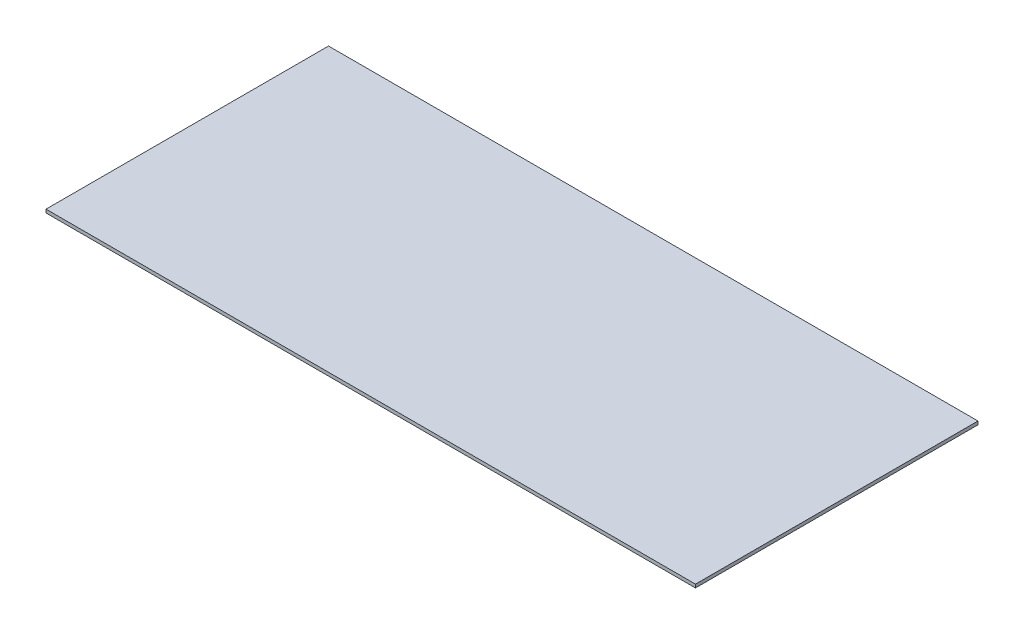
ISO-10303-21;
HEADER;
FILE_DESCRIPTION(('STEP AP214'),'2;1');
FILE_NAME('part.step','',(''),(''),'','','');
FILE_SCHEMA(('AUTOMOTIVE_DESIGN { 1 0 10303 214 1 1 1 1 }'));
ENDSEC;
DATA;
#1=APPLICATION_CONTEXT('core data for automotive mechanical design processes');
#2=APPLICATION_PROTOCOL_DEFINITION('international standard','automotive_design',2000,#1);
#3=PRODUCT_CONTEXT('',#1,'mechanical');
#4=PRODUCT('Part','Part','',(#3));
#5=PRODUCT_RELATED_PRODUCT_CATEGORY('part','',(#4));
#6=PRODUCT_DEFINITION_FORMATION('','',#4);
#7=PRODUCT_DEFINITION_CONTEXT('part definition',#1,'design');
#8=PRODUCT_DEFINITION('design','',#6,#7);
#9=PRODUCT_DEFINITION_SHAPE('','',#8);
#10=(LENGTH_UNIT() NAMED_UNIT(*) SI_UNIT(.MILLI.,.METRE.));
#11=(NAMED_UNIT(*) PLANE_ANGLE_UNIT() SI_UNIT($,.RADIAN.));
#12=(NAMED_UNIT(*) SI_UNIT($,.STERADIAN.) SOLID_ANGLE_UNIT());
#13=UNCERTAINTY_MEASURE_WITH_UNIT(LENGTH_MEASURE(1.E-05),#10,'distance_accuracy_value','');
#14=(GEOMETRIC_REPRESENTATION_CONTEXT(3) GLOBAL_UNCERTAINTY_ASSIGNED_CONTEXT((#13)) GLOBAL_UNIT_ASSIGNED_CONTEXT((#10,
#11,#12)) REPRESENTATION_CONTEXT('',''));
#15=CARTESIAN_POINT('',(0.,0.,0.));
#16=DIRECTION('',(0.,0.,1.));
#17=DIRECTION('',(1.,0.,0.));
#18=AXIS2_PLACEMENT_3D('',#15,#16,#17);
#19=CARTESIAN_POINT('',(194.25,2.,-84.5));
#20=DIRECTION('',(-1.,0.,0.));
#21=DIRECTION('',(0.,0.,1.));
#22=AXIS2_PLACEMENT_3D('',#19,#20,#21);
#23=PLANE('',#22);
#24=DIRECTION('',(0.,0.,-1.));
#25=VECTOR('',#24,1.);
#26=CARTESIAN_POINT('',(194.25,0.,-84.5));
#27=LINE('',#26,#25);
#28=CARTESIAN_POINT('',(194.25,0.,84.5));
#29=VERTEX_POINT('',#28);
#30=CARTESIAN_POINT('',(194.25,0.,-84.5));
#31=VERTEX_POINT('',#30);
#32=EDGE_CURVE('E111',#29,#31,#27,.T.);
#33=ORIENTED_EDGE('',*,*,#32,.T.);
#34=DIRECTION('',(0.,-1.,0.));
#35=VECTOR('',#34,1.);
#36=CARTESIAN_POINT('',(194.25,2.,-84.5));
#37=LINE('',#36,#35);
#38=CARTESIAN_POINT('',(194.25,2.,-84.5));
#39=VERTEX_POINT('',#38);
#40=EDGE_CURVE('E11',#39,#31,#37,.T.);
#41=ORIENTED_EDGE('',*,*,#40,.F.);
#42=DIRECTION('',(0.,0.,-1.));
#43=VECTOR('',#42,1.);
#44=CARTESIAN_POINT('',(194.25,2.,-84.5));
#45=LINE('',#44,#43);
#46=CARTESIAN_POINT('',(194.25,2.,84.5));
#47=VERTEX_POINT('',#46);
#48=EDGE_CURVE('E95',#47,#39,#45,.T.);
#49=ORIENTED_EDGE('',*,*,#48,.F.);
#50=DIRECTION('',(0.,-1.,0.));
#51=VECTOR('',#50,1.);
#52=CARTESIAN_POINT('',(194.25,2.,84.5));
#53=LINE('',#52,#51);
#54=EDGE_CURVE('E107',#47,#29,#53,.T.);
#55=ORIENTED_EDGE('',*,*,#54,.T.);
#56=EDGE_LOOP('',(#33,#41,#49,#55));
#57=FACE_BOUND('',#56,.T.);
#58=ADVANCED_FACE('F43',(#57),#23,.F.);
#59=CARTESIAN_POINT('',(-194.25,2.,-84.5));
#60=DIRECTION('',(0.,0.,1.));
#61=DIRECTION('',(1.,0.,0.));
#62=AXIS2_PLACEMENT_3D('',#59,#60,#61);
#63=PLANE('',#62);
#64=DIRECTION('',(-1.,0.,0.));
#65=VECTOR('',#64,1.);
#66=CARTESIAN_POINT('',(-194.25,0.,-84.5));
#67=LINE('',#66,#65);
#68=CARTESIAN_POINT('',(-194.25,0.,-84.5));
#69=VERTEX_POINT('',#68);
#70=EDGE_CURVE('E100',#31,#69,#67,.T.);
#71=ORIENTED_EDGE('',*,*,#70,.T.);
#72=DIRECTION('',(0.,-1.,0.));
#73=VECTOR('',#72,1.);
#74=CARTESIAN_POINT('',(-194.25,2.,-84.5));
#75=LINE('',#74,#73);
#76=CARTESIAN_POINT('',(-194.25,2.,-84.5));
#77=VERTEX_POINT('',#76);
#78=EDGE_CURVE('E52',#77,#69,#75,.T.);
#79=ORIENTED_EDGE('',*,*,#78,.F.);
#80=DIRECTION('',(-1.,0.,0.));
#81=VECTOR('',#80,1.);
#82=CARTESIAN_POINT('',(-194.25,2.,-84.5));
#83=LINE('',#82,#81);
#84=EDGE_CURVE('E90',#39,#77,#83,.T.);
#85=ORIENTED_EDGE('',*,*,#84,.F.);
#86=ORIENTED_EDGE('',*,*,#40,.T.);
#87=EDGE_LOOP('',(#71,#79,#85,#86));
#88=FACE_BOUND('',#87,.T.);
#89=ADVANCED_FACE('F99',(#88),#63,.F.);
#90=CARTESIAN_POINT('',(-194.25,2.,-84.5));
#91=DIRECTION('',(1.,0.,0.));
#92=DIRECTION('',(0.,0.,-1.));
#93=AXIS2_PLACEMENT_3D('',#90,#91,#92);
#94=PLANE('',#93);
#95=DIRECTION('',(0.,0.,1.));
#96=VECTOR('',#95,1.);
#97=CARTESIAN_POINT('',(-194.25,0.,-84.5));
#98=LINE('',#97,#96);
#99=CARTESIAN_POINT('',(-194.25,0.,84.5));
#100=VERTEX_POINT('',#99);
#101=EDGE_CURVE('E77',#69,#100,#98,.T.);
#102=ORIENTED_EDGE('',*,*,#101,.T.);
#103=DIRECTION('',(0.,-1.,0.));
#104=VECTOR('',#103,1.);
#105=CARTESIAN_POINT('',(-194.25,2.,84.5));
#106=LINE('',#105,#104);
#107=CARTESIAN_POINT('',(-194.25,2.,84.5));
#108=VERTEX_POINT('',#107);
#109=EDGE_CURVE('E102',#108,#100,#106,.T.);
#110=ORIENTED_EDGE('',*,*,#109,.F.);
#111=DIRECTION('',(0.,0.,1.));
#112=VECTOR('',#111,1.);
#113=CARTESIAN_POINT('',(-194.25,2.,-84.5));
#114=LINE('',#113,#112);
#115=EDGE_CURVE('E93',#77,#108,#114,.T.);
#116=ORIENTED_EDGE('',*,*,#115,.F.);
#117=ORIENTED_EDGE('',*,*,#78,.T.);
#118=EDGE_LOOP('',(#102,#110,#116,#117));
#119=FACE_BOUND('',#118,.T.);
#120=ADVANCED_FACE('F103',(#119),#94,.F.);
#121=CARTESIAN_POINT('',(-194.25,2.,84.5));
#122=DIRECTION('',(0.,0.,-1.));
#123=DIRECTION('',(-1.,0.,0.));
#124=AXIS2_PLACEMENT_3D('',#121,#122,#123);
#125=PLANE('',#124);
#126=DIRECTION('',(1.,0.,0.));
#127=VECTOR('',#126,1.);
#128=CARTESIAN_POINT('',(-194.25,0.,84.5));
#129=LINE('',#128,#127);
#130=EDGE_CURVE('E83',#100,#29,#129,.T.);
#131=ORIENTED_EDGE('',*,*,#130,.T.);
#132=ORIENTED_EDGE('',*,*,#54,.F.);
#133=DIRECTION('',(1.,0.,0.));
#134=VECTOR('',#133,1.);
#135=CARTESIAN_POINT('',(-194.25,2.,84.5));
#136=LINE('',#135,#134);
#137=EDGE_CURVE('E60',#108,#47,#136,.T.);
#138=ORIENTED_EDGE('',*,*,#137,.F.);
#139=ORIENTED_EDGE('',*,*,#109,.T.);
#140=EDGE_LOOP('',(#131,#132,#138,#139));
#141=FACE_BOUND('',#140,.T.);
#142=ADVANCED_FACE('F124',(#141),#125,.F.);
#143=CARTESIAN_POINT('',(0.,2.,0.));
#144=DIRECTION('',(0.,1.,0.));
#145=DIRECTION('',(0.,0.,1.));
#146=AXIS2_PLACEMENT_3D('',#143,#144,#145);
#147=PLANE('',#146);
#148=ORIENTED_EDGE('',*,*,#48,.T.);
#149=ORIENTED_EDGE('',*,*,#84,.T.);
#150=ORIENTED_EDGE('',*,*,#115,.T.);
#151=ORIENTED_EDGE('',*,*,#137,.T.);
#152=EDGE_LOOP('',(#148,#149,#150,#151));
#153=FACE_BOUND('',#152,.T.);
#154=ADVANCED_FACE('F91',(#153),#147,.T.);
#155=CARTESIAN_POINT('',(0.,0.,0.));
#156=DIRECTION('',(0.,1.,0.));
#157=DIRECTION('',(0.,0.,1.));
#158=AXIS2_PLACEMENT_3D('',#155,#156,#157);
#159=PLANE('',#158);
#160=ORIENTED_EDGE('',*,*,#32,.F.);
#161=ORIENTED_EDGE('',*,*,#130,.F.);
#162=ORIENTED_EDGE('',*,*,#101,.F.);
#163=ORIENTED_EDGE('',*,*,#70,.F.);
#164=EDGE_LOOP('',(#160,#161,#162,#163));
#165=FACE_BOUND('',#164,.T.);
#166=ADVANCED_FACE('F127',(#165),#159,.F.);
#167=CLOSED_SHELL('',(#58,#89,#120,#142,#154,#166));
#168=MANIFOLD_SOLID_BREP('B2',#167);
#169=ADVANCED_BREP_SHAPE_REPRESENTATION('',(#18,#168),#14);
#170=SHAPE_DEFINITION_REPRESENTATION(#9,#169);
ENDSEC;
END-ISO-10303-21;
